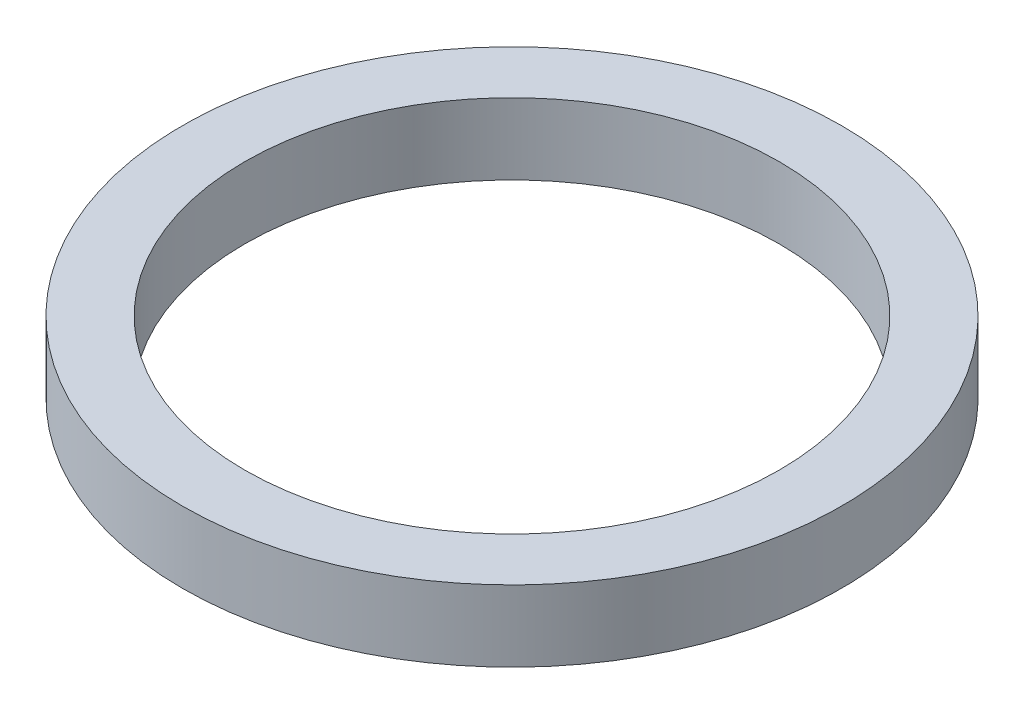
ISO-10303-21;
HEADER;
FILE_DESCRIPTION(('STEP AP214'),'2;1');
FILE_NAME('part.step','',(''),(''),'','','');
FILE_SCHEMA(('AUTOMOTIVE_DESIGN { 1 0 10303 214 1 1 1 1 }'));
ENDSEC;
DATA;
#1=APPLICATION_CONTEXT('core data for automotive mechanical design processes');
#2=APPLICATION_PROTOCOL_DEFINITION('international standard','automotive_design',2000,#1);
#3=PRODUCT_CONTEXT('',#1,'mechanical');
#4=PRODUCT('Part','Part','',(#3));
#5=PRODUCT_RELATED_PRODUCT_CATEGORY('part','',(#4));
#6=PRODUCT_DEFINITION_FORMATION('','',#4);
#7=PRODUCT_DEFINITION_CONTEXT('part definition',#1,'design');
#8=PRODUCT_DEFINITION('design','',#6,#7);
#9=PRODUCT_DEFINITION_SHAPE('','',#8);
#10=(LENGTH_UNIT() NAMED_UNIT(*) SI_UNIT(.MILLI.,.METRE.));
#11=(NAMED_UNIT(*) PLANE_ANGLE_UNIT() SI_UNIT($,.RADIAN.));
#12=(NAMED_UNIT(*) SI_UNIT($,.STERADIAN.) SOLID_ANGLE_UNIT());
#13=UNCERTAINTY_MEASURE_WITH_UNIT(LENGTH_MEASURE(1.E-05),#10,'distance_accuracy_value','');
#14=(GEOMETRIC_REPRESENTATION_CONTEXT(3) GLOBAL_UNCERTAINTY_ASSIGNED_CONTEXT((#13)) GLOBAL_UNIT_ASSIGNED_CONTEXT((#10,
#11,#12)) REPRESENTATION_CONTEXT('',''));
#15=CARTESIAN_POINT('',(0.,0.,0.));
#16=DIRECTION('',(0.,0.,1.));
#17=DIRECTION('',(1.,0.,0.));
#18=AXIS2_PLACEMENT_3D('',#15,#16,#17);
#19=CARTESIAN_POINT('',(0.,4.,0.));
#20=DIRECTION('',(0.,1.,0.));
#21=DIRECTION('',(0.,0.,1.));
#22=AXIS2_PLACEMENT_3D('',#19,#20,#21);
#23=PLANE('',#22);
#24=CARTESIAN_POINT('',(0.,4.,0.));
#25=DIRECTION('',(0.,1.,0.));
#26=DIRECTION('',(0.,0.,1.));
#27=AXIS2_PLACEMENT_3D('',#24,#25,#26);
#28=CIRCLE('',#27,18.5);
#29=CARTESIAN_POINT('',(0.,4.,18.5));
#30=VERTEX_POINT('',#29);
#31=EDGE_CURVE('E10',#30,#30,#28,.T.);
#32=ORIENTED_EDGE('',*,*,#31,.T.);
#33=EDGE_LOOP('',(#32));
#34=FACE_BOUND('',#33,.T.);
#35=CARTESIAN_POINT('',(0.,4.,0.));
#36=DIRECTION('',(0.,1.,0.));
#37=DIRECTION('',(0.,0.,1.));
#38=AXIS2_PLACEMENT_3D('',#35,#36,#37);
#39=CIRCLE('',#38,15.);
#40=CARTESIAN_POINT('',(0.,4.,15.));
#41=VERTEX_POINT('',#40);
#42=EDGE_CURVE('E57',#41,#41,#39,.T.);
#43=ORIENTED_EDGE('',*,*,#42,.F.);
#44=EDGE_LOOP('',(#43));
#45=FACE_BOUND('',#44,.T.);
#46=ADVANCED_FACE('F43',(#34,#45),#23,.T.);
#47=CARTESIAN_POINT('',(0.,0.,0.));
#48=DIRECTION('',(0.,1.,0.));
#49=DIRECTION('',(0.,0.,1.));
#50=AXIS2_PLACEMENT_3D('',#47,#48,#49);
#51=PLANE('',#50);
#52=CARTESIAN_POINT('',(0.,0.,0.));
#53=DIRECTION('',(0.,1.,0.));
#54=DIRECTION('',(0.,0.,1.));
#55=AXIS2_PLACEMENT_3D('',#52,#53,#54);
#56=CIRCLE('',#55,18.5);
#57=CARTESIAN_POINT('',(0.,0.,18.5));
#58=VERTEX_POINT('',#57);
#59=EDGE_CURVE('E50',#58,#58,#56,.T.);
#60=ORIENTED_EDGE('',*,*,#59,.F.);
#61=EDGE_LOOP('',(#60));
#62=FACE_BOUND('',#61,.T.);
#63=CARTESIAN_POINT('',(0.,0.,0.));
#64=DIRECTION('',(0.,1.,0.));
#65=DIRECTION('',(0.,0.,1.));
#66=AXIS2_PLACEMENT_3D('',#63,#64,#65);
#67=CIRCLE('',#66,15.);
#68=CARTESIAN_POINT('',(0.,0.,15.));
#69=VERTEX_POINT('',#68);
#70=EDGE_CURVE('E59',#69,#69,#67,.T.);
#71=ORIENTED_EDGE('',*,*,#70,.T.);
#72=EDGE_LOOP('',(#71));
#73=FACE_BOUND('',#72,.T.);
#74=ADVANCED_FACE('F68',(#62,#73),#51,.F.);
#75=CARTESIAN_POINT('',(0.,4.,0.));
#76=DIRECTION('',(0.,-1.,0.));
#77=DIRECTION('',(0.,0.,-1.));
#78=AXIS2_PLACEMENT_3D('',#75,#76,#77);
#79=CYLINDRICAL_SURFACE('',#78,18.5);
#80=ORIENTED_EDGE('',*,*,#31,.F.);
#81=EDGE_LOOP('',(#80));
#82=FACE_BOUND('',#81,.T.);
#83=ORIENTED_EDGE('',*,*,#59,.T.);
#84=EDGE_LOOP('',(#83));
#85=FACE_BOUND('',#84,.T.);
#86=ADVANCED_FACE('F44',(#82,#85),#79,.T.);
#87=CARTESIAN_POINT('',(0.,4.,0.));
#88=DIRECTION('',(0.,-1.,0.));
#89=DIRECTION('',(0.,0.,-1.));
#90=AXIS2_PLACEMENT_3D('',#87,#88,#89);
#91=CYLINDRICAL_SURFACE('',#90,15.);
#92=ORIENTED_EDGE('',*,*,#42,.T.);
#93=EDGE_LOOP('',(#92));
#94=FACE_BOUND('',#93,.T.);
#95=ORIENTED_EDGE('',*,*,#70,.F.);
#96=EDGE_LOOP('',(#95));
#97=FACE_BOUND('',#96,.T.);
#98=ADVANCED_FACE('F67',(#94,#97),#91,.F.);
#99=CLOSED_SHELL('',(#46,#74,#86,#98));
#100=MANIFOLD_SOLID_BREP('B2',#99);
#101=ADVANCED_BREP_SHAPE_REPRESENTATION('',(#18,#100),#14);
#102=SHAPE_DEFINITION_REPRESENTATION(#9,#101);
ENDSEC;
END-ISO-10303-21;
